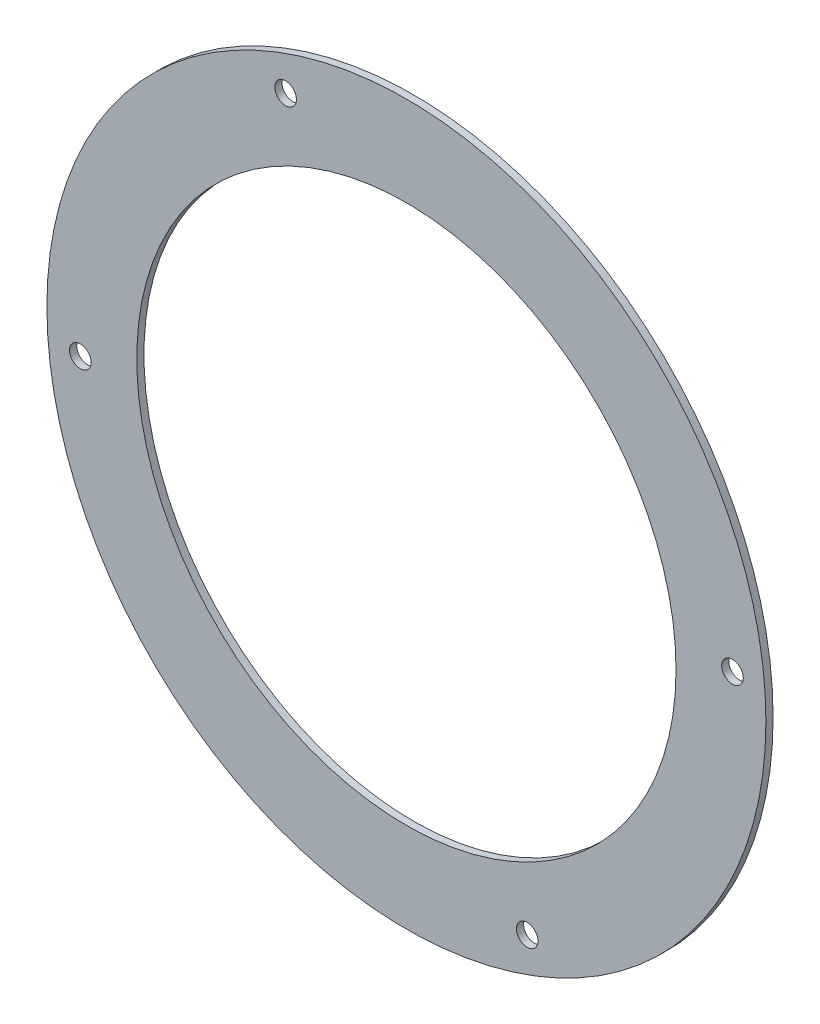
ISO-10303-21;
HEADER;
FILE_DESCRIPTION(('STEP AP214'),'2;1');
FILE_NAME('part.step','',(''),(''),'','','');
FILE_SCHEMA(('AUTOMOTIVE_DESIGN { 1 0 10303 214 1 1 1 1 }'));
ENDSEC;
DATA;
#1=APPLICATION_CONTEXT('core data for automotive mechanical design processes');
#2=APPLICATION_PROTOCOL_DEFINITION('international standard','automotive_design',2000,#1);
#3=PRODUCT_CONTEXT('',#1,'mechanical');
#4=PRODUCT('Part','Part','',(#3));
#5=PRODUCT_RELATED_PRODUCT_CATEGORY('part','',(#4));
#6=PRODUCT_DEFINITION_FORMATION('','',#4);
#7=PRODUCT_DEFINITION_CONTEXT('part definition',#1,'design');
#8=PRODUCT_DEFINITION('design','',#6,#7);
#9=PRODUCT_DEFINITION_SHAPE('','',#8);
#10=(LENGTH_UNIT() NAMED_UNIT(*) SI_UNIT(.MILLI.,.METRE.));
#11=(NAMED_UNIT(*) PLANE_ANGLE_UNIT() SI_UNIT($,.RADIAN.));
#12=(NAMED_UNIT(*) SI_UNIT($,.STERADIAN.) SOLID_ANGLE_UNIT());
#13=UNCERTAINTY_MEASURE_WITH_UNIT(LENGTH_MEASURE(1.E-05),#10,'distance_accuracy_value','');
#14=(GEOMETRIC_REPRESENTATION_CONTEXT(3) GLOBAL_UNCERTAINTY_ASSIGNED_CONTEXT((#13)) GLOBAL_UNIT_ASSIGNED_CONTEXT((#10,
#11,#12)) REPRESENTATION_CONTEXT('',''));
#15=CARTESIAN_POINT('',(0.,0.,0.));
#16=DIRECTION('',(0.,0.,1.));
#17=DIRECTION('',(1.,0.,0.));
#18=AXIS2_PLACEMENT_3D('',#15,#16,#17);
#19=CARTESIAN_POINT('',(-144.815895816909,-92.6234081848926,1.));
#20=DIRECTION('',(0.,0.,1.));
#21=DIRECTION('',(1.,0.,0.));
#22=AXIS2_PLACEMENT_3D('',#19,#20,#21);
#23=PLANE('',#22);
#24=CARTESIAN_POINT('',(-128.016696529803,-134.908593573065,1.));
#25=DIRECTION('',(0.,0.,1.));
#26=DIRECTION('',(1.,0.,0.));
#27=AXIS2_PLACEMENT_3D('',#24,#25,#26);
#28=CIRCLE('',#27,1.49999999999904);
#29=CARTESIAN_POINT('',(-126.516696529804,-134.908593573065,1.));
#30=VERTEX_POINT('',#29);
#31=EDGE_CURVE('E65',#30,#30,#28,.T.);
#32=ORIENTED_EDGE('',*,*,#31,.F.);
#33=EDGE_LOOP('',(#32));
#34=FACE_BOUND('',#33,.T.);
#35=CARTESIAN_POINT('',(-99.4646296525155,-88.9474515357581,1.));
#36=DIRECTION('',(0.,0.,1.));
#37=DIRECTION('',(-1.,0.,0.));
#38=AXIS2_PLACEMENT_3D('',#35,#36,#37);
#39=CIRCLE('',#38,1.49999999999904);
#40=CARTESIAN_POINT('',(-100.964629652515,-88.9474515357581,1.));
#41=VERTEX_POINT('',#40);
#42=EDGE_CURVE('E53',#41,#41,#39,.T.);
#43=ORIENTED_EDGE('',*,*,#42,.F.);
#44=EDGE_LOOP('',(#43));
#45=FACE_BOUND('',#44,.T.);
#46=CARTESIAN_POINT('',(-144.815895816909,-92.6234081848926,1.));
#47=DIRECTION('',(0.,0.,1.));
#48=DIRECTION('',(1.,0.,0.));
#49=AXIS2_PLACEMENT_3D('',#46,#47,#48);
#50=CIRCLE('',#49,50.);
#51=CARTESIAN_POINT('',(-94.8158958169092,-92.6234081848926,1.));
#52=VERTEX_POINT('',#51);
#53=EDGE_CURVE('E10',#52,#52,#50,.T.);
#54=ORIENTED_EDGE('',*,*,#53,.T.);
#55=EDGE_LOOP('',(#54));
#56=FACE_BOUND('',#55,.T.);
#57=CARTESIAN_POINT('',(-144.815895816909,-92.6234081848926,1.));
#58=DIRECTION('',(0.,0.,1.));
#59=DIRECTION('',(1.,0.,0.));
#60=AXIS2_PLACEMENT_3D('',#57,#58,#59);
#61=CIRCLE('',#60,37.5);
#62=CARTESIAN_POINT('',(-107.315895816909,-92.6234081848926,1.));
#63=VERTEX_POINT('',#62);
#64=EDGE_CURVE('E48',#63,#63,#61,.T.);
#65=ORIENTED_EDGE('',*,*,#64,.F.);
#66=EDGE_LOOP('',(#65));
#67=FACE_BOUND('',#66,.T.);
#68=CARTESIAN_POINT('',(-190.167161981303,-96.299364834027,1.));
#69=DIRECTION('',(0.,0.,1.));
#70=DIRECTION('',(1.,0.,0.));
#71=AXIS2_PLACEMENT_3D('',#68,#69,#70);
#72=CIRCLE('',#71,1.5);
#73=CARTESIAN_POINT('',(-188.667161981303,-96.299364834027,1.));
#74=VERTEX_POINT('',#73);
#75=EDGE_CURVE('E59',#74,#74,#72,.T.);
#76=ORIENTED_EDGE('',*,*,#75,.F.);
#77=EDGE_LOOP('',(#76));
#78=FACE_BOUND('',#77,.T.);
#79=CARTESIAN_POINT('',(-161.615095104015,-50.3382227967203,1.));
#80=DIRECTION('',(0.,0.,1.));
#81=DIRECTION('',(-1.,0.,0.));
#82=AXIS2_PLACEMENT_3D('',#79,#80,#81);
#83=CIRCLE('',#82,1.5);
#84=CARTESIAN_POINT('',(-163.115095104015,-50.3382227967203,1.));
#85=VERTEX_POINT('',#84);
#86=EDGE_CURVE('E71',#85,#85,#83,.T.);
#87=ORIENTED_EDGE('',*,*,#86,.F.);
#88=EDGE_LOOP('',(#87));
#89=FACE_BOUND('',#88,.T.);
#90=ADVANCED_FACE('F37',(#34,#45,#56,#67,#78,#89),#23,.T.);
#91=CARTESIAN_POINT('',(-144.815895816909,-92.6234081848926,0.));
#92=DIRECTION('',(0.,0.,1.));
#93=DIRECTION('',(1.,0.,0.));
#94=AXIS2_PLACEMENT_3D('',#91,#92,#93);
#95=PLANE('',#94);
#96=CARTESIAN_POINT('',(-144.815895816909,-92.6234081848926,0.));
#97=DIRECTION('',(0.,0.,1.));
#98=DIRECTION('',(1.,0.,0.));
#99=AXIS2_PLACEMENT_3D('',#96,#97,#98);
#100=CIRCLE('',#99,50.);
#101=CARTESIAN_POINT('',(-94.8158958169092,-92.6234081848926,0.));
#102=VERTEX_POINT('',#101);
#103=EDGE_CURVE('E41',#102,#102,#100,.T.);
#104=ORIENTED_EDGE('',*,*,#103,.F.);
#105=EDGE_LOOP('',(#104));
#106=FACE_BOUND('',#105,.T.);
#107=CARTESIAN_POINT('',(-144.815895816909,-92.6234081848926,0.));
#108=DIRECTION('',(0.,0.,1.));
#109=DIRECTION('',(1.,0.,0.));
#110=AXIS2_PLACEMENT_3D('',#107,#108,#109);
#111=CIRCLE('',#110,37.5);
#112=CARTESIAN_POINT('',(-107.315895816909,-92.6234081848926,0.));
#113=VERTEX_POINT('',#112);
#114=EDGE_CURVE('E50',#113,#113,#111,.T.);
#115=ORIENTED_EDGE('',*,*,#114,.T.);
#116=EDGE_LOOP('',(#115));
#117=FACE_BOUND('',#116,.T.);
#118=CARTESIAN_POINT('',(-99.4646296525155,-88.9474515357581,0.));
#119=DIRECTION('',(0.,0.,1.));
#120=DIRECTION('',(-1.,0.,0.));
#121=AXIS2_PLACEMENT_3D('',#118,#119,#120);
#122=CIRCLE('',#121,1.49999999999904);
#123=CARTESIAN_POINT('',(-100.964629652515,-88.9474515357581,0.));
#124=VERTEX_POINT('',#123);
#125=EDGE_CURVE('E56',#124,#124,#122,.T.);
#126=ORIENTED_EDGE('',*,*,#125,.T.);
#127=EDGE_LOOP('',(#126));
#128=FACE_BOUND('',#127,.T.);
#129=CARTESIAN_POINT('',(-190.167161981303,-96.299364834027,0.));
#130=DIRECTION('',(0.,0.,1.));
#131=DIRECTION('',(1.,0.,0.));
#132=AXIS2_PLACEMENT_3D('',#129,#130,#131);
#133=CIRCLE('',#132,1.5);
#134=CARTESIAN_POINT('',(-188.667161981303,-96.299364834027,0.));
#135=VERTEX_POINT('',#134);
#136=EDGE_CURVE('E62',#135,#135,#133,.T.);
#137=ORIENTED_EDGE('',*,*,#136,.T.);
#138=EDGE_LOOP('',(#137));
#139=FACE_BOUND('',#138,.T.);
#140=CARTESIAN_POINT('',(-128.016696529803,-134.908593573065,0.));
#141=DIRECTION('',(0.,0.,1.));
#142=DIRECTION('',(1.,0.,0.));
#143=AXIS2_PLACEMENT_3D('',#140,#141,#142);
#144=CIRCLE('',#143,1.49999999999904);
#145=CARTESIAN_POINT('',(-126.516696529804,-134.908593573065,0.));
#146=VERTEX_POINT('',#145);
#147=EDGE_CURVE('E68',#146,#146,#144,.T.);
#148=ORIENTED_EDGE('',*,*,#147,.T.);
#149=EDGE_LOOP('',(#148));
#150=FACE_BOUND('',#149,.T.);
#151=CARTESIAN_POINT('',(-161.615095104015,-50.3382227967203,0.));
#152=DIRECTION('',(0.,0.,1.));
#153=DIRECTION('',(-1.,0.,0.));
#154=AXIS2_PLACEMENT_3D('',#151,#152,#153);
#155=CIRCLE('',#154,1.5);
#156=CARTESIAN_POINT('',(-163.115095104015,-50.3382227967203,0.));
#157=VERTEX_POINT('',#156);
#158=EDGE_CURVE('E74',#157,#157,#155,.T.);
#159=ORIENTED_EDGE('',*,*,#158,.T.);
#160=EDGE_LOOP('',(#159));
#161=FACE_BOUND('',#160,.T.);
#162=ADVANCED_FACE('F84',(#106,#117,#128,#139,#150,#161),#95,.F.);
#163=CARTESIAN_POINT('',(-144.815895816909,-92.6234081848926,1.));
#164=DIRECTION('',(0.,0.,-1.));
#165=DIRECTION('',(-1.,0.,0.));
#166=AXIS2_PLACEMENT_3D('',#163,#164,#165);
#167=CYLINDRICAL_SURFACE('',#166,50.);
#168=ORIENTED_EDGE('',*,*,#53,.F.);
#169=EDGE_LOOP('',(#168));
#170=FACE_BOUND('',#169,.T.);
#171=ORIENTED_EDGE('',*,*,#103,.T.);
#172=EDGE_LOOP('',(#171));
#173=FACE_BOUND('',#172,.T.);
#174=ADVANCED_FACE('F39',(#170,#173),#167,.T.);
#175=CARTESIAN_POINT('',(-144.815895816909,-92.6234081848926,1.));
#176=DIRECTION('',(0.,0.,-1.));
#177=DIRECTION('',(-1.,0.,0.));
#178=AXIS2_PLACEMENT_3D('',#175,#176,#177);
#179=CYLINDRICAL_SURFACE('',#178,37.5);
#180=ORIENTED_EDGE('',*,*,#64,.T.);
#181=EDGE_LOOP('',(#180));
#182=FACE_BOUND('',#181,.T.);
#183=ORIENTED_EDGE('',*,*,#114,.F.);
#184=EDGE_LOOP('',(#183));
#185=FACE_BOUND('',#184,.T.);
#186=ADVANCED_FACE('F94',(#182,#185),#179,.F.);
#187=CARTESIAN_POINT('',(-99.4646296525155,-88.9474515357581,1.));
#188=DIRECTION('',(0.,0.,-1.));
#189=DIRECTION('',(-1.,0.,0.));
#190=AXIS2_PLACEMENT_3D('',#187,#188,#189);
#191=CYLINDRICAL_SURFACE('',#190,1.49999999999904);
#192=ORIENTED_EDGE('',*,*,#42,.T.);
#193=EDGE_LOOP('',(#192));
#194=FACE_BOUND('',#193,.T.);
#195=ORIENTED_EDGE('',*,*,#125,.F.);
#196=EDGE_LOOP('',(#195));
#197=FACE_BOUND('',#196,.T.);
#198=ADVANCED_FACE('F97',(#194,#197),#191,.F.);
#199=CARTESIAN_POINT('',(-190.167161981303,-96.299364834027,1.));
#200=DIRECTION('',(0.,0.,-1.));
#201=DIRECTION('',(-1.,0.,0.));
#202=AXIS2_PLACEMENT_3D('',#199,#200,#201);
#203=CYLINDRICAL_SURFACE('',#202,1.5);
#204=ORIENTED_EDGE('',*,*,#75,.T.);
#205=EDGE_LOOP('',(#204));
#206=FACE_BOUND('',#205,.T.);
#207=ORIENTED_EDGE('',*,*,#136,.F.);
#208=EDGE_LOOP('',(#207));
#209=FACE_BOUND('',#208,.T.);
#210=ADVANCED_FACE('F101',(#206,#209),#203,.F.);
#211=CARTESIAN_POINT('',(-128.016696529803,-134.908593573065,1.));
#212=DIRECTION('',(0.,0.,-1.));
#213=DIRECTION('',(-1.,0.,0.));
#214=AXIS2_PLACEMENT_3D('',#211,#212,#213);
#215=CYLINDRICAL_SURFACE('',#214,1.49999999999904);
#216=ORIENTED_EDGE('',*,*,#31,.T.);
#217=EDGE_LOOP('',(#216));
#218=FACE_BOUND('',#217,.T.);
#219=ORIENTED_EDGE('',*,*,#147,.F.);
#220=EDGE_LOOP('',(#219));
#221=FACE_BOUND('',#220,.T.);
#222=ADVANCED_FACE('F105',(#218,#221),#215,.F.);
#223=CARTESIAN_POINT('',(-161.615095104015,-50.3382227967203,1.));
#224=DIRECTION('',(0.,0.,-1.));
#225=DIRECTION('',(-1.,0.,0.));
#226=AXIS2_PLACEMENT_3D('',#223,#224,#225);
#227=CYLINDRICAL_SURFACE('',#226,1.5);
#228=ORIENTED_EDGE('',*,*,#86,.T.);
#229=EDGE_LOOP('',(#228));
#230=FACE_BOUND('',#229,.T.);
#231=ORIENTED_EDGE('',*,*,#158,.F.);
#232=EDGE_LOOP('',(#231));
#233=FACE_BOUND('',#232,.T.);
#234=ADVANCED_FACE('F80',(#230,#233),#227,.F.);
#235=CLOSED_SHELL('',(#90,#162,#174,#186,#198,#210,#222,#234));
#236=MANIFOLD_SOLID_BREP('B2',#235);
#237=ADVANCED_BREP_SHAPE_REPRESENTATION('',(#18,#236),#14);
#238=SHAPE_DEFINITION_REPRESENTATION(#9,#237);
ENDSEC;
END-ISO-10303-21;
